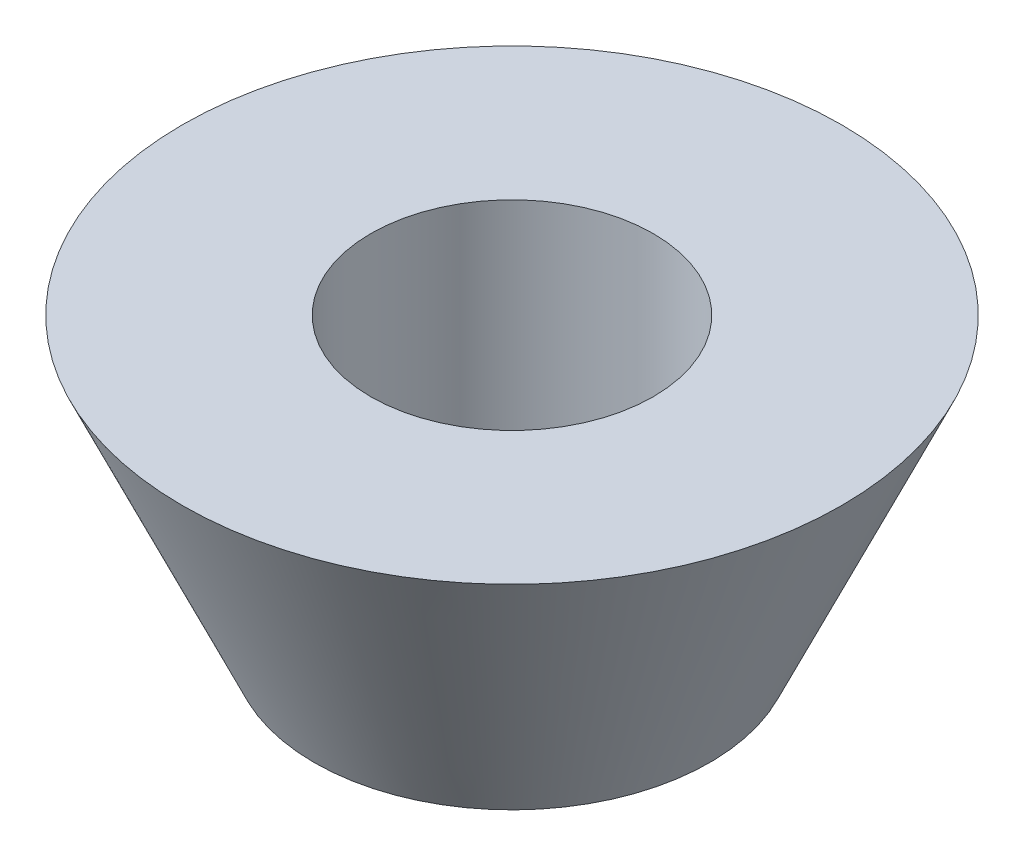
ISO-10303-21;
HEADER;
FILE_DESCRIPTION(('STEP AP214'),'2;1');
FILE_NAME('part.step','',(''),(''),'','','');
FILE_SCHEMA(('AUTOMOTIVE_DESIGN { 1 0 10303 214 1 1 1 1 }'));
ENDSEC;
DATA;
#1=APPLICATION_CONTEXT('core data for automotive mechanical design processes');
#2=APPLICATION_PROTOCOL_DEFINITION('international standard','automotive_design',2000,#1);
#3=PRODUCT_CONTEXT('',#1,'mechanical');
#4=PRODUCT('Part','Part','',(#3));
#5=PRODUCT_RELATED_PRODUCT_CATEGORY('part','',(#4));
#6=PRODUCT_DEFINITION_FORMATION('','',#4);
#7=PRODUCT_DEFINITION_CONTEXT('part definition',#1,'design');
#8=PRODUCT_DEFINITION('design','',#6,#7);
#9=PRODUCT_DEFINITION_SHAPE('','',#8);
#10=(LENGTH_UNIT() NAMED_UNIT(*) SI_UNIT(.MILLI.,.METRE.));
#11=(NAMED_UNIT(*) PLANE_ANGLE_UNIT() SI_UNIT($,.RADIAN.));
#12=(NAMED_UNIT(*) SI_UNIT($,.STERADIAN.) SOLID_ANGLE_UNIT());
#13=UNCERTAINTY_MEASURE_WITH_UNIT(LENGTH_MEASURE(1.E-05),#10,'distance_accuracy_value','');
#14=(GEOMETRIC_REPRESENTATION_CONTEXT(3) GLOBAL_UNCERTAINTY_ASSIGNED_CONTEXT((#13)) GLOBAL_UNIT_ASSIGNED_CONTEXT((#10,
#11,#12)) REPRESENTATION_CONTEXT('',''));
#15=CARTESIAN_POINT('',(0.,0.,0.));
#16=DIRECTION('',(0.,0.,1.));
#17=DIRECTION('',(1.,0.,0.));
#18=AXIS2_PLACEMENT_3D('',#15,#16,#17);
#19=CARTESIAN_POINT('',(11.1125,18.7723086792185,0.));
#20=DIRECTION('',(0.,-1.,0.));
#21=DIRECTION('',(0.,0.,-1.));
#22=AXIS2_PLACEMENT_3D('',#19,#20,#21);
#23=PLANE('',#22);
#24=CARTESIAN_POINT('',(0.,18.7723086792185,0.));
#25=DIRECTION('',(0.,1.,0.));
#26=DIRECTION('',(0.,0.,1.));
#27=AXIS2_PLACEMENT_3D('',#24,#25,#26);
#28=CIRCLE('',#27,4.7625);
#29=CARTESIAN_POINT('',(0.,18.7723086792185,4.7625));
#30=VERTEX_POINT('',#29);
#31=EDGE_CURVE('E10',#30,#30,#28,.T.);
#32=ORIENTED_EDGE('',*,*,#31,.F.);
#33=EDGE_LOOP('',(#32));
#34=FACE_BOUND('',#33,.T.);
#35=CARTESIAN_POINT('',(0.,18.7723086792185,0.));
#36=DIRECTION('',(0.,1.,0.));
#37=DIRECTION('',(0.,0.,1.));
#38=AXIS2_PLACEMENT_3D('',#35,#36,#37);
#39=CIRCLE('',#38,11.1125);
#40=CARTESIAN_POINT('',(0.,18.7723086792185,11.1125));
#41=VERTEX_POINT('',#40);
#42=EDGE_CURVE('E53',#41,#41,#39,.T.);
#43=ORIENTED_EDGE('',*,*,#42,.T.);
#44=EDGE_LOOP('',(#43));
#45=FACE_BOUND('',#44,.T.);
#46=ADVANCED_FACE('F39',(#34,#45),#23,.F.);
#47=CARTESIAN_POINT('',(0.,55.,0.));
#48=DIRECTION('',(0.,1.,0.));
#49=DIRECTION('',(0.,0.,1.));
#50=AXIS2_PLACEMENT_3D('',#47,#48,#49);
#51=CYLINDRICAL_SURFACE('',#50,4.7625);
#52=CARTESIAN_POINT('',(0.,9.04537867921854,0.));
#53=DIRECTION('',(0.,1.,0.));
#54=DIRECTION('',(0.,0.,1.));
#55=AXIS2_PLACEMENT_3D('',#52,#53,#54);
#56=CIRCLE('',#55,4.7625);
#57=CARTESIAN_POINT('',(0.,9.04537867921854,4.7625));
#58=VERTEX_POINT('',#57);
#59=EDGE_CURVE('E45',#58,#58,#56,.T.);
#60=ORIENTED_EDGE('',*,*,#59,.F.);
#61=EDGE_LOOP('',(#60));
#62=FACE_BOUND('',#61,.T.);
#63=ORIENTED_EDGE('',*,*,#31,.T.);
#64=EDGE_LOOP('',(#63));
#65=FACE_BOUND('',#64,.T.);
#66=ADVANCED_FACE('F68',(#62,#65),#51,.F.);
#67=CARTESIAN_POINT('',(4.7625,9.04537867921854,0.));
#68=DIRECTION('',(0.,1.,0.));
#69=DIRECTION('',(0.,0.,1.));
#70=AXIS2_PLACEMENT_3D('',#67,#68,#69);
#71=PLANE('',#70);
#72=CARTESIAN_POINT('',(0.,9.04537867921854,0.));
#73=DIRECTION('',(0.,1.,0.));
#74=DIRECTION('',(0.,0.,1.));
#75=AXIS2_PLACEMENT_3D('',#72,#73,#74);
#76=CIRCLE('',#75,6.6675);
#77=CARTESIAN_POINT('',(0.,9.04537867921854,6.6675));
#78=VERTEX_POINT('',#77);
#79=EDGE_CURVE('E49',#78,#78,#76,.T.);
#80=ORIENTED_EDGE('',*,*,#79,.F.);
#81=EDGE_LOOP('',(#80));
#82=FACE_BOUND('',#81,.T.);
#83=ORIENTED_EDGE('',*,*,#59,.T.);
#84=EDGE_LOOP('',(#83));
#85=FACE_BOUND('',#84,.T.);
#86=ADVANCED_FACE('F63',(#82,#85),#71,.F.);
#87=CARTESIAN_POINT('',(0.,9.04537867921854,0.));
#88=DIRECTION('',(0.,1.,0.));
#89=DIRECTION('',(0.,0.,1.));
#90=AXIS2_PLACEMENT_3D('',#87,#88,#89);
#91=CONICAL_SURFACE('',#90,6.6675,0.428642252216573);
#92=ORIENTED_EDGE('',*,*,#42,.F.);
#93=EDGE_LOOP('',(#92));
#94=FACE_BOUND('',#93,.T.);
#95=ORIENTED_EDGE('',*,*,#79,.T.);
#96=EDGE_LOOP('',(#95));
#97=FACE_BOUND('',#96,.T.);
#98=ADVANCED_FACE('F60',(#94,#97),#91,.T.);
#99=CLOSED_SHELL('',(#46,#66,#86,#98));
#100=MANIFOLD_SOLID_BREP('B2',#99);
#101=ADVANCED_BREP_SHAPE_REPRESENTATION('',(#18,#100),#14);
#102=SHAPE_DEFINITION_REPRESENTATION(#9,#101);
ENDSEC;
END-ISO-10303-21;
